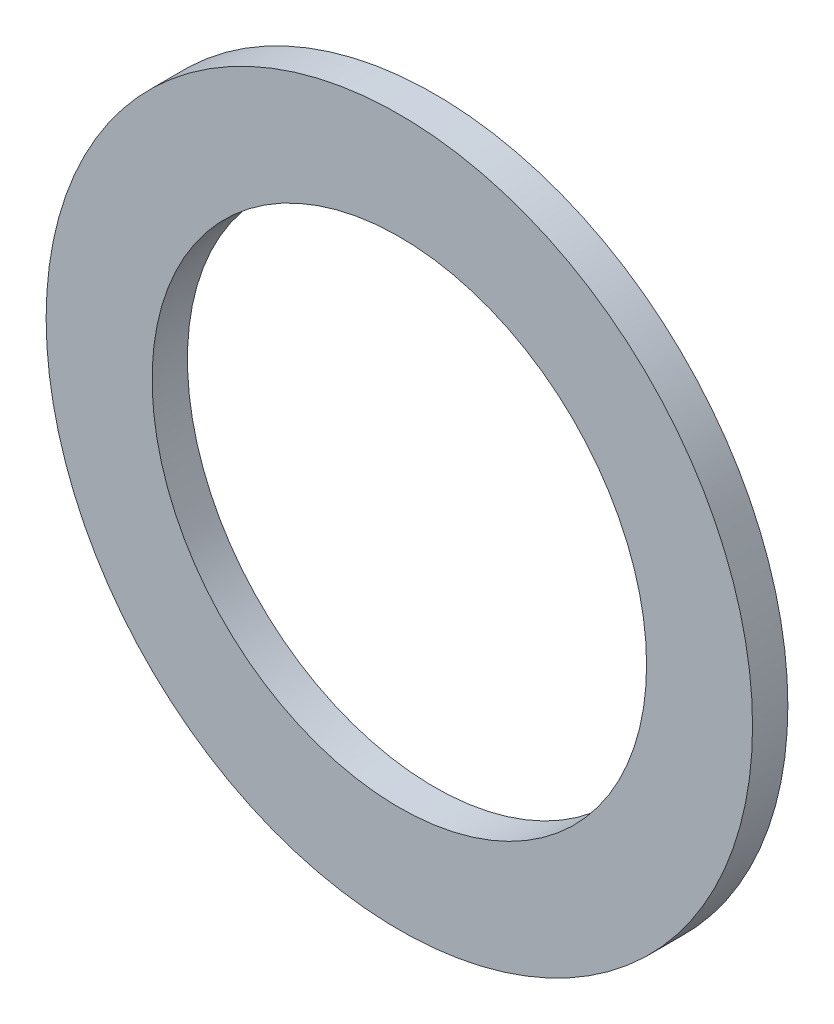
ISO-10303-21;
HEADER;
FILE_DESCRIPTION(('STEP AP214'),'2;1');
FILE_NAME('part.step','',(''),(''),'','','');
FILE_SCHEMA(('AUTOMOTIVE_DESIGN { 1 0 10303 214 1 1 1 1 }'));
ENDSEC;
DATA;
#1=APPLICATION_CONTEXT('core data for automotive mechanical design processes');
#2=APPLICATION_PROTOCOL_DEFINITION('international standard','automotive_design',2000,#1);
#3=PRODUCT_CONTEXT('',#1,'mechanical');
#4=PRODUCT('Part','Part','',(#3));
#5=PRODUCT_RELATED_PRODUCT_CATEGORY('part','',(#4));
#6=PRODUCT_DEFINITION_FORMATION('','',#4);
#7=PRODUCT_DEFINITION_CONTEXT('part definition',#1,'design');
#8=PRODUCT_DEFINITION('design','',#6,#7);
#9=PRODUCT_DEFINITION_SHAPE('','',#8);
#10=(LENGTH_UNIT() NAMED_UNIT(*) SI_UNIT(.MILLI.,.METRE.));
#11=(NAMED_UNIT(*) PLANE_ANGLE_UNIT() SI_UNIT($,.RADIAN.));
#12=(NAMED_UNIT(*) SI_UNIT($,.STERADIAN.) SOLID_ANGLE_UNIT());
#13=UNCERTAINTY_MEASURE_WITH_UNIT(LENGTH_MEASURE(1.E-05),#10,'distance_accuracy_value','');
#14=(GEOMETRIC_REPRESENTATION_CONTEXT(3) GLOBAL_UNCERTAINTY_ASSIGNED_CONTEXT((#13)) GLOBAL_UNIT_ASSIGNED_CONTEXT((#10,
#11,#12)) REPRESENTATION_CONTEXT('',''));
#15=CARTESIAN_POINT('',(0.,0.,0.));
#16=DIRECTION('',(0.,0.,1.));
#17=DIRECTION('',(1.,0.,0.));
#18=AXIS2_PLACEMENT_3D('',#15,#16,#17);
#19=CARTESIAN_POINT('',(0.,0.,0.5));
#20=DIRECTION('',(0.,0.,1.));
#21=DIRECTION('',(1.,0.,0.));
#22=AXIS2_PLACEMENT_3D('',#19,#20,#21);
#23=PLANE('',#22);
#24=CARTESIAN_POINT('',(0.,0.,0.5));
#25=DIRECTION('',(0.,0.,1.));
#26=DIRECTION('',(1.,0.,0.));
#27=AXIS2_PLACEMENT_3D('',#24,#25,#26);
#28=CIRCLE('',#27,5.);
#29=CARTESIAN_POINT('',(5.,0.,0.5));
#30=VERTEX_POINT('',#29);
#31=EDGE_CURVE('E10',#30,#30,#28,.T.);
#32=ORIENTED_EDGE('',*,*,#31,.T.);
#33=EDGE_LOOP('',(#32));
#34=FACE_BOUND('',#33,.T.);
#35=CARTESIAN_POINT('',(0.,0.,0.5));
#36=DIRECTION('',(0.,0.,1.));
#37=DIRECTION('',(1.,0.,0.));
#38=AXIS2_PLACEMENT_3D('',#35,#36,#37);
#39=CIRCLE('',#38,3.5);
#40=CARTESIAN_POINT('',(3.5,0.,0.5));
#41=VERTEX_POINT('',#40);
#42=EDGE_CURVE('E56',#41,#41,#39,.T.);
#43=ORIENTED_EDGE('',*,*,#42,.F.);
#44=EDGE_LOOP('',(#43));
#45=FACE_BOUND('',#44,.T.);
#46=ADVANCED_FACE('F39',(#34,#45),#23,.T.);
#47=CARTESIAN_POINT('',(0.,0.,0.));
#48=DIRECTION('',(0.,0.,1.));
#49=DIRECTION('',(1.,0.,0.));
#50=AXIS2_PLACEMENT_3D('',#47,#48,#49);
#51=PLANE('',#50);
#52=CARTESIAN_POINT('',(0.,0.,0.));
#53=DIRECTION('',(0.,0.,1.));
#54=DIRECTION('',(1.,0.,0.));
#55=AXIS2_PLACEMENT_3D('',#52,#53,#54);
#56=CIRCLE('',#55,5.);
#57=CARTESIAN_POINT('',(5.,0.,0.));
#58=VERTEX_POINT('',#57);
#59=EDGE_CURVE('E43',#58,#58,#56,.T.);
#60=ORIENTED_EDGE('',*,*,#59,.F.);
#61=EDGE_LOOP('',(#60));
#62=FACE_BOUND('',#61,.T.);
#63=CARTESIAN_POINT('',(0.,0.,0.));
#64=DIRECTION('',(0.,0.,1.));
#65=DIRECTION('',(1.,0.,0.));
#66=AXIS2_PLACEMENT_3D('',#63,#64,#65);
#67=CIRCLE('',#66,3.5);
#68=CARTESIAN_POINT('',(3.5,0.,0.));
#69=VERTEX_POINT('',#68);
#70=EDGE_CURVE('E58',#69,#69,#67,.T.);
#71=ORIENTED_EDGE('',*,*,#70,.T.);
#72=EDGE_LOOP('',(#71));
#73=FACE_BOUND('',#72,.T.);
#74=ADVANCED_FACE('F71',(#62,#73),#51,.F.);
#75=CARTESIAN_POINT('',(0.,0.,0.5));
#76=DIRECTION('',(0.,0.,-1.));
#77=DIRECTION('',(-1.,0.,0.));
#78=AXIS2_PLACEMENT_3D('',#75,#76,#77);
#79=CYLINDRICAL_SURFACE('',#78,5.);
#80=ORIENTED_EDGE('',*,*,#31,.F.);
#81=EDGE_LOOP('',(#80));
#82=FACE_BOUND('',#81,.T.);
#83=ORIENTED_EDGE('',*,*,#59,.T.);
#84=EDGE_LOOP('',(#83));
#85=FACE_BOUND('',#84,.T.);
#86=ADVANCED_FACE('F41',(#82,#85),#79,.T.);
#87=CARTESIAN_POINT('',(0.,0.,0.5));
#88=DIRECTION('',(0.,0.,-1.));
#89=DIRECTION('',(-1.,0.,0.));
#90=AXIS2_PLACEMENT_3D('',#87,#88,#89);
#91=CYLINDRICAL_SURFACE('',#90,3.5);
#92=ORIENTED_EDGE('',*,*,#42,.T.);
#93=EDGE_LOOP('',(#92));
#94=FACE_BOUND('',#93,.T.);
#95=ORIENTED_EDGE('',*,*,#70,.F.);
#96=EDGE_LOOP('',(#95));
#97=FACE_BOUND('',#96,.T.);
#98=ADVANCED_FACE('F67',(#94,#97),#91,.F.);
#99=CLOSED_SHELL('',(#46,#74,#86,#98));
#100=MANIFOLD_SOLID_BREP('B2',#99);
#101=ADVANCED_BREP_SHAPE_REPRESENTATION('',(#18,#100),#14);
#102=SHAPE_DEFINITION_REPRESENTATION(#9,#101);
ENDSEC;
END-ISO-10303-21;
